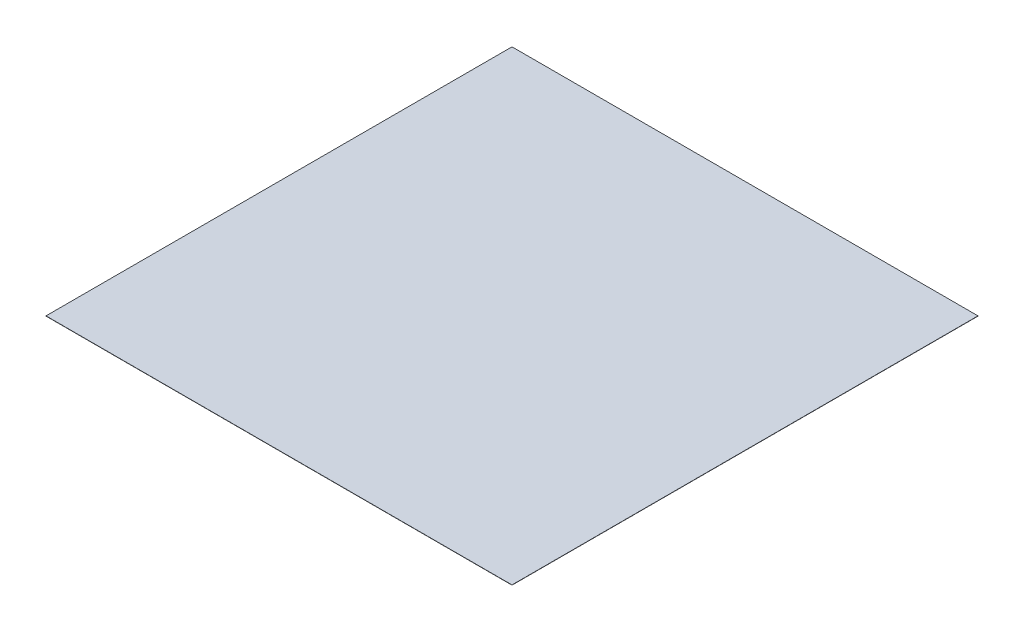
ISO-10303-21;
HEADER;
FILE_DESCRIPTION(('STEP AP214'),'2;1');
FILE_NAME('part.step','',(''),(''),'','','');
FILE_SCHEMA(('AUTOMOTIVE_DESIGN { 1 0 10303 214 1 1 1 1 }'));
ENDSEC;
DATA;
#1=APPLICATION_CONTEXT('core data for automotive mechanical design processes');
#2=APPLICATION_PROTOCOL_DEFINITION('international standard','automotive_design',2000,#1);
#3=PRODUCT_CONTEXT('',#1,'mechanical');
#4=PRODUCT('Part','Part','',(#3));
#5=PRODUCT_RELATED_PRODUCT_CATEGORY('part','',(#4));
#6=PRODUCT_DEFINITION_FORMATION('','',#4);
#7=PRODUCT_DEFINITION_CONTEXT('part definition',#1,'design');
#8=PRODUCT_DEFINITION('design','',#6,#7);
#9=PRODUCT_DEFINITION_SHAPE('','',#8);
#10=(LENGTH_UNIT() NAMED_UNIT(*) SI_UNIT(.MILLI.,.METRE.));
#11=(NAMED_UNIT(*) PLANE_ANGLE_UNIT() SI_UNIT($,.RADIAN.));
#12=(NAMED_UNIT(*) SI_UNIT($,.STERADIAN.) SOLID_ANGLE_UNIT());
#13=UNCERTAINTY_MEASURE_WITH_UNIT(LENGTH_MEASURE(1.E-05),#10,'distance_accuracy_value','');
#14=(GEOMETRIC_REPRESENTATION_CONTEXT(3) GLOBAL_UNCERTAINTY_ASSIGNED_CONTEXT((#13)) GLOBAL_UNIT_ASSIGNED_CONTEXT((#10,
#11,#12)) REPRESENTATION_CONTEXT('',''));
#15=CARTESIAN_POINT('',(0.,0.,0.));
#16=DIRECTION('',(0.,0.,1.));
#17=DIRECTION('',(1.,0.,0.));
#18=AXIS2_PLACEMENT_3D('',#15,#16,#17);
#19=CARTESIAN_POINT('',(1000.,1.,-1000.));
#20=DIRECTION('',(-1.,0.,0.));
#21=DIRECTION('',(0.,0.,1.));
#22=AXIS2_PLACEMENT_3D('',#19,#20,#21);
#23=PLANE('',#22);
#24=DIRECTION('',(0.,0.,-1.));
#25=VECTOR('',#24,1.);
#26=CARTESIAN_POINT('',(1000.,0.,-1000.));
#27=LINE('',#26,#25);
#28=CARTESIAN_POINT('',(1000.,0.,1000.));
#29=VERTEX_POINT('',#28);
#30=CARTESIAN_POINT('',(1000.,0.,-1000.));
#31=VERTEX_POINT('',#30);
#32=EDGE_CURVE('E102',#29,#31,#27,.T.);
#33=ORIENTED_EDGE('',*,*,#32,.T.);
#34=DIRECTION('',(0.,-1.,0.));
#35=VECTOR('',#34,1.);
#36=CARTESIAN_POINT('',(1000.,1.,-1000.));
#37=LINE('',#36,#35);
#38=CARTESIAN_POINT('',(1000.,1.,-1000.));
#39=VERTEX_POINT('',#38);
#40=EDGE_CURVE('E11',#39,#31,#37,.T.);
#41=ORIENTED_EDGE('',*,*,#40,.F.);
#42=DIRECTION('',(0.,0.,-1.));
#43=VECTOR('',#42,1.);
#44=CARTESIAN_POINT('',(1000.,1.,-1000.));
#45=LINE('',#44,#43);
#46=CARTESIAN_POINT('',(1000.,1.,1000.));
#47=VERTEX_POINT('',#46);
#48=EDGE_CURVE('E90',#47,#39,#45,.T.);
#49=ORIENTED_EDGE('',*,*,#48,.F.);
#50=DIRECTION('',(0.,-1.,0.));
#51=VECTOR('',#50,1.);
#52=CARTESIAN_POINT('',(1000.,1.,1000.));
#53=LINE('',#52,#51);
#54=EDGE_CURVE('E98',#47,#29,#53,.T.);
#55=ORIENTED_EDGE('',*,*,#54,.T.);
#56=EDGE_LOOP('',(#33,#41,#49,#55));
#57=FACE_BOUND('',#56,.T.);
#58=ADVANCED_FACE('F39',(#57),#23,.F.);
#59=CARTESIAN_POINT('',(-1000.,1.,-1000.));
#60=DIRECTION('',(0.,0.,1.));
#61=DIRECTION('',(1.,0.,0.));
#62=AXIS2_PLACEMENT_3D('',#59,#60,#61);
#63=PLANE('',#62);
#64=DIRECTION('',(-1.,0.,0.));
#65=VECTOR('',#64,1.);
#66=CARTESIAN_POINT('',(-1000.,0.,-1000.));
#67=LINE('',#66,#65);
#68=CARTESIAN_POINT('',(-1000.,0.,-1000.));
#69=VERTEX_POINT('',#68);
#70=EDGE_CURVE('E94',#31,#69,#67,.T.);
#71=ORIENTED_EDGE('',*,*,#70,.T.);
#72=DIRECTION('',(0.,-1.,0.));
#73=VECTOR('',#72,1.);
#74=CARTESIAN_POINT('',(-1000.,1.,-1000.));
#75=LINE('',#74,#73);
#76=CARTESIAN_POINT('',(-1000.,1.,-1000.));
#77=VERTEX_POINT('',#76);
#78=EDGE_CURVE('E47',#77,#69,#75,.T.);
#79=ORIENTED_EDGE('',*,*,#78,.F.);
#80=DIRECTION('',(-1.,0.,0.));
#81=VECTOR('',#80,1.);
#82=CARTESIAN_POINT('',(-1000.,1.,-1000.));
#83=LINE('',#82,#81);
#84=EDGE_CURVE('E85',#39,#77,#83,.T.);
#85=ORIENTED_EDGE('',*,*,#84,.F.);
#86=ORIENTED_EDGE('',*,*,#40,.T.);
#87=EDGE_LOOP('',(#71,#79,#85,#86));
#88=FACE_BOUND('',#87,.T.);
#89=ADVANCED_FACE('F93',(#88),#63,.F.);
#90=CARTESIAN_POINT('',(-1000.,1.,-1000.));
#91=DIRECTION('',(1.,0.,0.));
#92=DIRECTION('',(0.,0.,-1.));
#93=AXIS2_PLACEMENT_3D('',#90,#91,#92);
#94=PLANE('',#93);
#95=DIRECTION('',(0.,0.,1.));
#96=VECTOR('',#95,1.);
#97=CARTESIAN_POINT('',(-1000.,0.,-1000.));
#98=LINE('',#97,#96);
#99=CARTESIAN_POINT('',(-1000.,0.,1000.));
#100=VERTEX_POINT('',#99);
#101=EDGE_CURVE('E72',#69,#100,#98,.T.);
#102=ORIENTED_EDGE('',*,*,#101,.T.);
#103=DIRECTION('',(0.,-1.,0.));
#104=VECTOR('',#103,1.);
#105=CARTESIAN_POINT('',(-1000.,1.,1000.));
#106=LINE('',#105,#104);
#107=CARTESIAN_POINT('',(-1000.,1.,1000.));
#108=VERTEX_POINT('',#107);
#109=EDGE_CURVE('E95',#108,#100,#106,.T.);
#110=ORIENTED_EDGE('',*,*,#109,.F.);
#111=DIRECTION('',(0.,0.,1.));
#112=VECTOR('',#111,1.);
#113=CARTESIAN_POINT('',(-1000.,1.,-1000.));
#114=LINE('',#113,#112);
#115=EDGE_CURVE('E88',#77,#108,#114,.T.);
#116=ORIENTED_EDGE('',*,*,#115,.F.);
#117=ORIENTED_EDGE('',*,*,#78,.T.);
#118=EDGE_LOOP('',(#102,#110,#116,#117));
#119=FACE_BOUND('',#118,.T.);
#120=ADVANCED_FACE('F96',(#119),#94,.F.);
#121=CARTESIAN_POINT('',(-1000.,1.,1000.));
#122=DIRECTION('',(0.,0.,-1.));
#123=DIRECTION('',(-1.,0.,0.));
#124=AXIS2_PLACEMENT_3D('',#121,#122,#123);
#125=PLANE('',#124);
#126=DIRECTION('',(1.,0.,0.));
#127=VECTOR('',#126,1.);
#128=CARTESIAN_POINT('',(-1000.,0.,1000.));
#129=LINE('',#128,#127);
#130=EDGE_CURVE('E78',#100,#29,#129,.T.);
#131=ORIENTED_EDGE('',*,*,#130,.T.);
#132=ORIENTED_EDGE('',*,*,#54,.F.);
#133=DIRECTION('',(1.,0.,0.));
#134=VECTOR('',#133,1.);
#135=CARTESIAN_POINT('',(-1000.,1.,1000.));
#136=LINE('',#135,#134);
#137=EDGE_CURVE('E55',#108,#47,#136,.T.);
#138=ORIENTED_EDGE('',*,*,#137,.F.);
#139=ORIENTED_EDGE('',*,*,#109,.T.);
#140=EDGE_LOOP('',(#131,#132,#138,#139));
#141=FACE_BOUND('',#140,.T.);
#142=ADVANCED_FACE('F109',(#141),#125,.F.);
#143=CARTESIAN_POINT('',(0.,1.,0.));
#144=DIRECTION('',(0.,1.,0.));
#145=DIRECTION('',(0.,0.,1.));
#146=AXIS2_PLACEMENT_3D('',#143,#144,#145);
#147=PLANE('',#146);
#148=ORIENTED_EDGE('',*,*,#48,.T.);
#149=ORIENTED_EDGE('',*,*,#84,.T.);
#150=ORIENTED_EDGE('',*,*,#115,.T.);
#151=ORIENTED_EDGE('',*,*,#137,.T.);
#152=EDGE_LOOP('',(#148,#149,#150,#151));
#153=FACE_BOUND('',#152,.T.);
#154=ADVANCED_FACE('F86',(#153),#147,.T.);
#155=CARTESIAN_POINT('',(0.,0.,0.));
#156=DIRECTION('',(0.,1.,0.));
#157=DIRECTION('',(0.,0.,1.));
#158=AXIS2_PLACEMENT_3D('',#155,#156,#157);
#159=PLANE('',#158);
#160=ORIENTED_EDGE('',*,*,#32,.F.);
#161=ORIENTED_EDGE('',*,*,#130,.F.);
#162=ORIENTED_EDGE('',*,*,#101,.F.);
#163=ORIENTED_EDGE('',*,*,#70,.F.);
#164=EDGE_LOOP('',(#160,#161,#162,#163));
#165=FACE_BOUND('',#164,.T.);
#166=ADVANCED_FACE('F112',(#165),#159,.F.);
#167=CLOSED_SHELL('',(#58,#89,#120,#142,#154,#166));
#168=MANIFOLD_SOLID_BREP('B2',#167);
#169=ADVANCED_BREP_SHAPE_REPRESENTATION('',(#18,#168),#14);
#170=SHAPE_DEFINITION_REPRESENTATION(#9,#169);
ENDSEC;
END-ISO-10303-21;
